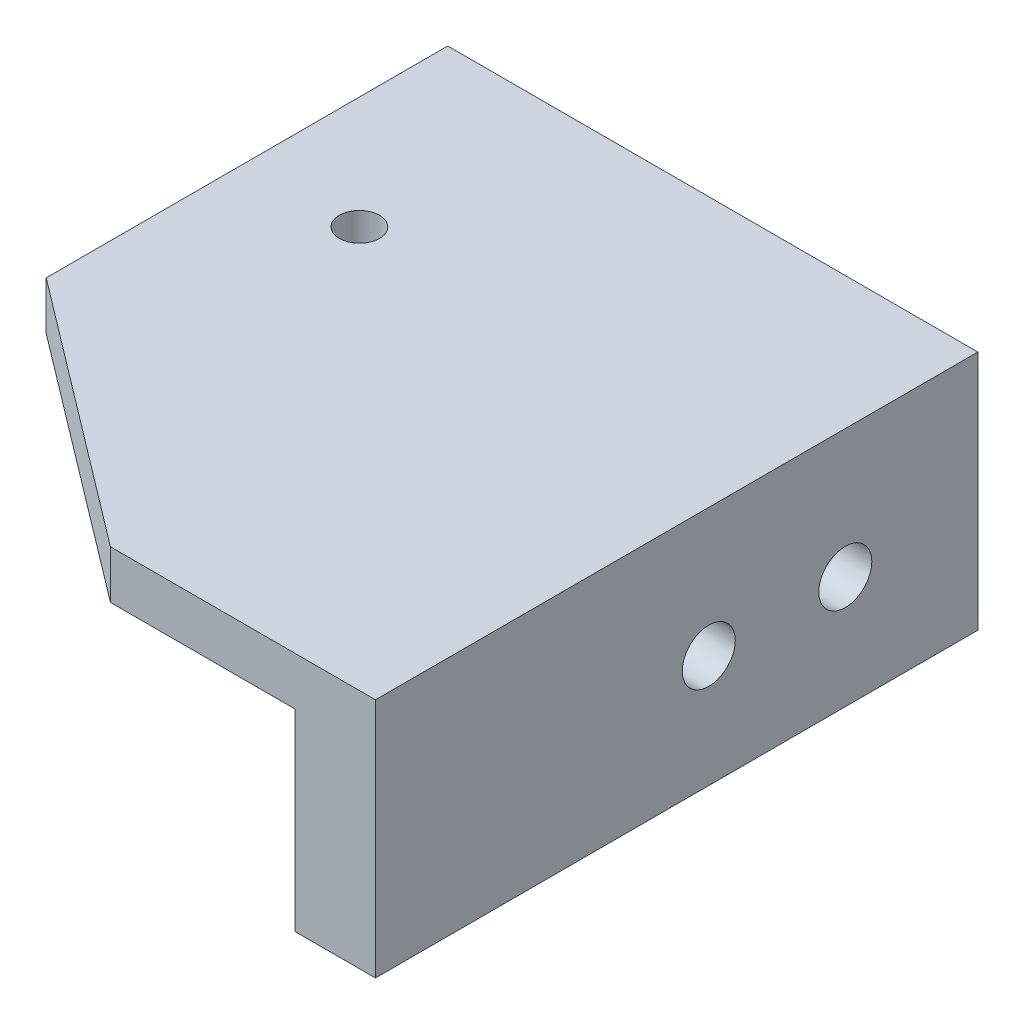
ISO-10303-21;
HEADER;
FILE_DESCRIPTION(('STEP AP214'),'2;1');
FILE_NAME('part.step','',(''),(''),'','','');
FILE_SCHEMA(('AUTOMOTIVE_DESIGN { 1 0 10303 214 1 1 1 1 }'));
ENDSEC;
DATA;
#1=APPLICATION_CONTEXT('core data for automotive mechanical design processes');
#2=APPLICATION_PROTOCOL_DEFINITION('international standard','automotive_design',2000,#1);
#3=PRODUCT_CONTEXT('',#1,'mechanical');
#4=PRODUCT('Part','Part','',(#3));
#5=PRODUCT_RELATED_PRODUCT_CATEGORY('part','',(#4));
#6=PRODUCT_DEFINITION_FORMATION('','',#4);
#7=PRODUCT_DEFINITION_CONTEXT('part definition',#1,'design');
#8=PRODUCT_DEFINITION('design','',#6,#7);
#9=PRODUCT_DEFINITION_SHAPE('','',#8);
#10=(LENGTH_UNIT() NAMED_UNIT(*) SI_UNIT(.MILLI.,.METRE.));
#11=(NAMED_UNIT(*) PLANE_ANGLE_UNIT() SI_UNIT($,.RADIAN.));
#12=(NAMED_UNIT(*) SI_UNIT($,.STERADIAN.) SOLID_ANGLE_UNIT());
#13=UNCERTAINTY_MEASURE_WITH_UNIT(LENGTH_MEASURE(1.E-05),#10,'distance_accuracy_value','');
#14=(GEOMETRIC_REPRESENTATION_CONTEXT(3) GLOBAL_UNCERTAINTY_ASSIGNED_CONTEXT((#13)) GLOBAL_UNIT_ASSIGNED_CONTEXT((#10,
#11,#12)) REPRESENTATION_CONTEXT('',''));
#15=CARTESIAN_POINT('',(0.,0.,0.));
#16=DIRECTION('',(0.,0.,1.));
#17=DIRECTION('',(1.,0.,0.));
#18=AXIS2_PLACEMENT_3D('',#15,#16,#17);
#19=CARTESIAN_POINT('',(-16.5,7.5,-12.5));
#20=DIRECTION('',(-1.,0.,0.));
#21=DIRECTION('',(0.,0.,1.));
#22=AXIS2_PLACEMENT_3D('',#19,#20,#21);
#23=PLANE('',#22);
#24=DIRECTION('',(0.,1.,0.));
#25=VECTOR('',#24,1.);
#26=CARTESIAN_POINT('',(-16.5,-7.5,12.5));
#27=LINE('',#26,#25);
#28=CARTESIAN_POINT('',(-16.5,4.5,12.5));
#29=VERTEX_POINT('',#28);
#30=CARTESIAN_POINT('',(-16.5,7.5,12.5));
#31=VERTEX_POINT('',#30);
#32=EDGE_CURVE('E48',#29,#31,#27,.T.);
#33=ORIENTED_EDGE('',*,*,#32,.T.);
#34=DIRECTION('',(0.,0.,1.));
#35=VECTOR('',#34,1.);
#36=CARTESIAN_POINT('',(-16.5,7.5,-12.5));
#37=LINE('',#36,#35);
#38=CARTESIAN_POINT('',(-16.5,7.5,-12.5));
#39=VERTEX_POINT('',#38);
#40=EDGE_CURVE('E41',#39,#31,#37,.T.);
#41=ORIENTED_EDGE('',*,*,#40,.F.);
#42=DIRECTION('',(0.,-1.,0.));
#43=VECTOR('',#42,1.);
#44=CARTESIAN_POINT('',(-16.5,7.5,-12.5));
#45=LINE('',#44,#43);
#46=CARTESIAN_POINT('',(-16.5,4.5,-12.5));
#47=VERTEX_POINT('',#46);
#48=EDGE_CURVE('E111',#39,#47,#45,.T.);
#49=ORIENTED_EDGE('',*,*,#48,.T.);
#50=DIRECTION('',(0.,0.,1.));
#51=VECTOR('',#50,1.);
#52=CARTESIAN_POINT('',(-16.5,4.5,-12.5));
#53=LINE('',#52,#51);
#54=EDGE_CURVE('E148',#47,#29,#53,.T.);
#55=ORIENTED_EDGE('',*,*,#54,.T.);
#56=EDGE_LOOP('',(#33,#41,#49,#55));
#57=FACE_BOUND('',#56,.T.);
#58=ADVANCED_FACE('F34',(#57),#23,.T.);
#59=CARTESIAN_POINT('',(-16.5,7.5,-12.5));
#60=DIRECTION('',(0.,1.,0.));
#61=DIRECTION('',(0.,0.,1.));
#62=AXIS2_PLACEMENT_3D('',#59,#60,#61);
#63=PLANE('',#62);
#64=DIRECTION('',(-0.79709214815401,0.,-0.603857687995462));
#65=VECTOR('',#64,1.);
#66=CARTESIAN_POINT('',(0.,7.5,25.));
#67=LINE('',#66,#65);
#68=CARTESIAN_POINT('',(0.,7.5,25.));
#69=VERTEX_POINT('',#68);
#70=EDGE_CURVE('E93',#69,#31,#67,.T.);
#71=ORIENTED_EDGE('',*,*,#70,.F.);
#72=DIRECTION('',(-1.,0.,0.));
#73=VECTOR('',#72,1.);
#74=CARTESIAN_POINT('',(-16.5,7.5,25.));
#75=LINE('',#74,#73);
#76=CARTESIAN_POINT('',(16.5,7.5,25.));
#77=VERTEX_POINT('',#76);
#78=EDGE_CURVE('E104',#77,#69,#75,.T.);
#79=ORIENTED_EDGE('',*,*,#78,.F.);
#80=DIRECTION('',(0.,0.,1.));
#81=VECTOR('',#80,1.);
#82=CARTESIAN_POINT('',(16.5,7.5,-12.5));
#83=LINE('',#82,#81);
#84=CARTESIAN_POINT('',(16.5,7.5,-12.5));
#85=VERTEX_POINT('',#84);
#86=EDGE_CURVE('E128',#85,#77,#83,.T.);
#87=ORIENTED_EDGE('',*,*,#86,.F.);
#88=DIRECTION('',(-1.,0.,0.));
#89=VECTOR('',#88,1.);
#90=CARTESIAN_POINT('',(-16.5,7.5,-12.5));
#91=LINE('',#90,#89);
#92=EDGE_CURVE('E124',#85,#39,#91,.T.);
#93=ORIENTED_EDGE('',*,*,#92,.T.);
#94=ORIENTED_EDGE('',*,*,#40,.T.);
#95=EDGE_LOOP('',(#71,#79,#87,#93,#94));
#96=FACE_BOUND('',#95,.T.);
#97=CARTESIAN_POINT('',(-9.5,7.5,0.));
#98=DIRECTION('',(0.,1.,0.));
#99=DIRECTION('',(0.,0.,1.));
#100=AXIS2_PLACEMENT_3D('',#97,#98,#99);
#101=CIRCLE('',#100,1.24999999999999);
#102=CARTESIAN_POINT('',(-9.5,7.5,1.24999999999999));
#103=VERTEX_POINT('',#102);
#104=EDGE_CURVE('E163',#103,#103,#101,.T.);
#105=ORIENTED_EDGE('',*,*,#104,.F.);
#106=EDGE_LOOP('',(#105));
#107=FACE_BOUND('',#106,.T.);
#108=ADVANCED_FACE('F102',(#96,#107),#63,.T.);
#109=CARTESIAN_POINT('',(16.5,7.5,-12.5));
#110=DIRECTION('',(1.,0.,0.));
#111=DIRECTION('',(0.,0.,-1.));
#112=AXIS2_PLACEMENT_3D('',#109,#110,#111);
#113=PLANE('',#112);
#114=CARTESIAN_POINT('',(16.5,-0.5,4.25));
#115=DIRECTION('',(1.,0.,0.));
#116=DIRECTION('',(0.,0.,-1.));
#117=AXIS2_PLACEMENT_3D('',#114,#115,#116);
#118=CIRCLE('',#117,1.64999999999999);
#119=CARTESIAN_POINT('',(16.5,-0.5,2.60000000000001));
#120=VERTEX_POINT('',#119);
#121=EDGE_CURVE('E149',#120,#120,#118,.T.);
#122=ORIENTED_EDGE('',*,*,#121,.F.);
#123=EDGE_LOOP('',(#122));
#124=FACE_BOUND('',#123,.T.);
#125=CARTESIAN_POINT('',(16.5,-0.499999999999999,-4.25));
#126=DIRECTION('',(1.,0.,0.));
#127=DIRECTION('',(0.,0.,-1.));
#128=AXIS2_PLACEMENT_3D('',#125,#126,#127);
#129=CIRCLE('',#128,1.64999999999999);
#130=CARTESIAN_POINT('',(16.5,-0.499999999999999,-5.89999999999999));
#131=VERTEX_POINT('',#130);
#132=EDGE_CURVE('E157',#131,#131,#129,.T.);
#133=ORIENTED_EDGE('',*,*,#132,.F.);
#134=EDGE_LOOP('',(#133));
#135=FACE_BOUND('',#134,.T.);
#136=ORIENTED_EDGE('',*,*,#86,.T.);
#137=DIRECTION('',(0.,1.,0.));
#138=VECTOR('',#137,1.);
#139=CARTESIAN_POINT('',(16.5,7.5,25.));
#140=LINE('',#139,#138);
#141=CARTESIAN_POINT('',(16.5,-7.5,25.));
#142=VERTEX_POINT('',#141);
#143=EDGE_CURVE('E110',#142,#77,#140,.T.);
#144=ORIENTED_EDGE('',*,*,#143,.F.);
#145=DIRECTION('',(0.,0.,1.));
#146=VECTOR('',#145,1.);
#147=CARTESIAN_POINT('',(16.5,-7.5,-12.5));
#148=LINE('',#147,#146);
#149=CARTESIAN_POINT('',(16.5,-7.5,-12.5));
#150=VERTEX_POINT('',#149);
#151=EDGE_CURVE('E126',#150,#142,#148,.T.);
#152=ORIENTED_EDGE('',*,*,#151,.F.);
#153=DIRECTION('',(0.,1.,0.));
#154=VECTOR('',#153,1.);
#155=CARTESIAN_POINT('',(16.5,7.5,-12.5));
#156=LINE('',#155,#154);
#157=EDGE_CURVE('E121',#150,#85,#156,.T.);
#158=ORIENTED_EDGE('',*,*,#157,.T.);
#159=EDGE_LOOP('',(#136,#144,#152,#158));
#160=FACE_BOUND('',#159,.T.);
#161=ADVANCED_FACE('F137',(#124,#135,#160),#113,.T.);
#162=CARTESIAN_POINT('',(-16.5,-7.5,-12.5));
#163=DIRECTION('',(0.,-1.,0.));
#164=DIRECTION('',(0.,0.,-1.));
#165=AXIS2_PLACEMENT_3D('',#162,#163,#164);
#166=PLANE('',#165);
#167=DIRECTION('',(0.,0.,1.));
#168=VECTOR('',#167,1.);
#169=CARTESIAN_POINT('',(11.5,-7.5,-12.5));
#170=LINE('',#169,#168);
#171=CARTESIAN_POINT('',(11.5,-7.5,-12.5));
#172=VERTEX_POINT('',#171);
#173=CARTESIAN_POINT('',(11.5,-7.5,25.));
#174=VERTEX_POINT('',#173);
#175=EDGE_CURVE('E55',#172,#174,#170,.T.);
#176=ORIENTED_EDGE('',*,*,#175,.F.);
#177=DIRECTION('',(1.,0.,0.));
#178=VECTOR('',#177,1.);
#179=CARTESIAN_POINT('',(-16.5,-7.5,-12.5));
#180=LINE('',#179,#178);
#181=EDGE_CURVE('E114',#172,#150,#180,.T.);
#182=ORIENTED_EDGE('',*,*,#181,.T.);
#183=ORIENTED_EDGE('',*,*,#151,.T.);
#184=DIRECTION('',(1.,0.,0.));
#185=VECTOR('',#184,1.);
#186=CARTESIAN_POINT('',(-16.5,-7.5,25.));
#187=LINE('',#186,#185);
#188=EDGE_CURVE('E116',#174,#142,#187,.T.);
#189=ORIENTED_EDGE('',*,*,#188,.F.);
#190=EDGE_LOOP('',(#176,#182,#183,#189));
#191=FACE_BOUND('',#190,.T.);
#192=ADVANCED_FACE('F133',(#191),#166,.T.);
#193=CARTESIAN_POINT('',(0.,0.,-12.5));
#194=DIRECTION('',(0.,0.,1.));
#195=DIRECTION('',(1.,0.,0.));
#196=AXIS2_PLACEMENT_3D('',#193,#194,#195);
#197=PLANE('',#196);
#198=DIRECTION('',(0.,1.,0.));
#199=VECTOR('',#198,1.);
#200=CARTESIAN_POINT('',(11.5,-7.5,-12.5));
#201=LINE('',#200,#199);
#202=CARTESIAN_POINT('',(11.5,4.5,-12.5));
#203=VERTEX_POINT('',#202);
#204=EDGE_CURVE('E170',#172,#203,#201,.T.);
#205=ORIENTED_EDGE('',*,*,#204,.T.);
#206=DIRECTION('',(-1.,0.,0.));
#207=VECTOR('',#206,1.);
#208=CARTESIAN_POINT('',(-16.5,4.5,-12.5));
#209=LINE('',#208,#207);
#210=EDGE_CURVE('E145',#203,#47,#209,.T.);
#211=ORIENTED_EDGE('',*,*,#210,.T.);
#212=ORIENTED_EDGE('',*,*,#48,.F.);
#213=ORIENTED_EDGE('',*,*,#92,.F.);
#214=ORIENTED_EDGE('',*,*,#157,.F.);
#215=ORIENTED_EDGE('',*,*,#181,.F.);
#216=EDGE_LOOP('',(#205,#211,#212,#213,#214,#215));
#217=FACE_BOUND('',#216,.T.);
#218=ADVANCED_FACE('F142',(#217),#197,.F.);
#219=CARTESIAN_POINT('',(0.,0.,25.));
#220=DIRECTION('',(0.,0.,1.));
#221=DIRECTION('',(1.,0.,0.));
#222=AXIS2_PLACEMENT_3D('',#219,#220,#221);
#223=PLANE('',#222);
#224=DIRECTION('',(0.,1.,0.));
#225=VECTOR('',#224,1.);
#226=CARTESIAN_POINT('',(0.,-7.5,25.));
#227=LINE('',#226,#225);
#228=CARTESIAN_POINT('',(0.,4.5,25.));
#229=VERTEX_POINT('',#228);
#230=EDGE_CURVE('E90',#229,#69,#227,.T.);
#231=ORIENTED_EDGE('',*,*,#230,.F.);
#232=DIRECTION('',(-1.,0.,0.));
#233=VECTOR('',#232,1.);
#234=CARTESIAN_POINT('',(-16.5,4.5,25.));
#235=LINE('',#234,#233);
#236=CARTESIAN_POINT('',(11.5,4.5,25.));
#237=VERTEX_POINT('',#236);
#238=EDGE_CURVE('E172',#237,#229,#235,.T.);
#239=ORIENTED_EDGE('',*,*,#238,.F.);
#240=DIRECTION('',(0.,1.,0.));
#241=VECTOR('',#240,1.);
#242=CARTESIAN_POINT('',(11.5,-7.5,25.));
#243=LINE('',#242,#241);
#244=EDGE_CURVE('E169',#174,#237,#243,.T.);
#245=ORIENTED_EDGE('',*,*,#244,.F.);
#246=ORIENTED_EDGE('',*,*,#188,.T.);
#247=ORIENTED_EDGE('',*,*,#143,.T.);
#248=ORIENTED_EDGE('',*,*,#78,.T.);
#249=EDGE_LOOP('',(#231,#239,#245,#246,#247,#248));
#250=FACE_BOUND('',#249,.T.);
#251=ADVANCED_FACE('F108',(#250),#223,.T.);
#252=CARTESIAN_POINT('',(-16.5,4.5,-12.5));
#253=DIRECTION('',(0.,1.,0.));
#254=DIRECTION('',(0.,0.,1.));
#255=AXIS2_PLACEMENT_3D('',#252,#253,#254);
#256=PLANE('',#255);
#257=CARTESIAN_POINT('',(-9.5,4.5,0.));
#258=DIRECTION('',(0.,1.,0.));
#259=DIRECTION('',(0.,0.,1.));
#260=AXIS2_PLACEMENT_3D('',#257,#258,#259);
#261=CIRCLE('',#260,1.24999999999999);
#262=CARTESIAN_POINT('',(-9.5,4.5,1.24999999999999));
#263=VERTEX_POINT('',#262);
#264=EDGE_CURVE('E166',#263,#263,#261,.T.);
#265=ORIENTED_EDGE('',*,*,#264,.T.);
#266=EDGE_LOOP('',(#265));
#267=FACE_BOUND('',#266,.T.);
#268=ORIENTED_EDGE('',*,*,#238,.T.);
#269=DIRECTION('',(-0.797092148154011,0.,-0.603857687995462));
#270=VECTOR('',#269,1.);
#271=CARTESIAN_POINT('',(-28.5332555425904,4.5,3.38389731621937));
#272=LINE('',#271,#270);
#273=EDGE_CURVE('E11',#229,#29,#272,.T.);
#274=ORIENTED_EDGE('',*,*,#273,.T.);
#275=ORIENTED_EDGE('',*,*,#54,.F.);
#276=ORIENTED_EDGE('',*,*,#210,.F.);
#277=DIRECTION('',(0.,0.,1.));
#278=VECTOR('',#277,1.);
#279=CARTESIAN_POINT('',(11.5,4.5,-12.5));
#280=LINE('',#279,#278);
#281=EDGE_CURVE('E177',#203,#237,#280,.T.);
#282=ORIENTED_EDGE('',*,*,#281,.T.);
#283=EDGE_LOOP('',(#268,#274,#275,#276,#282));
#284=FACE_BOUND('',#283,.T.);
#285=ADVANCED_FACE('F181',(#267,#284),#256,.F.);
#286=CARTESIAN_POINT('',(11.5,-7.5,-12.5));
#287=DIRECTION('',(1.,0.,0.));
#288=DIRECTION('',(0.,0.,-1.));
#289=AXIS2_PLACEMENT_3D('',#286,#287,#288);
#290=PLANE('',#289);
#291=CARTESIAN_POINT('',(11.5,-0.5,4.25));
#292=DIRECTION('',(1.,0.,0.));
#293=DIRECTION('',(0.,0.,-1.));
#294=AXIS2_PLACEMENT_3D('',#291,#292,#293);
#295=CIRCLE('',#294,1.65);
#296=CARTESIAN_POINT('',(11.5,-0.5,2.6));
#297=VERTEX_POINT('',#296);
#298=EDGE_CURVE('E152',#297,#297,#295,.T.);
#299=ORIENTED_EDGE('',*,*,#298,.T.);
#300=EDGE_LOOP('',(#299));
#301=FACE_BOUND('',#300,.T.);
#302=CARTESIAN_POINT('',(11.5,-0.499999999999999,-4.25));
#303=DIRECTION('',(1.,0.,0.));
#304=DIRECTION('',(0.,0.,-1.));
#305=AXIS2_PLACEMENT_3D('',#302,#303,#304);
#306=CIRCLE('',#305,1.65);
#307=CARTESIAN_POINT('',(11.5,-0.499999999999999,-5.9));
#308=VERTEX_POINT('',#307);
#309=EDGE_CURVE('E160',#308,#308,#306,.T.);
#310=ORIENTED_EDGE('',*,*,#309,.T.);
#311=EDGE_LOOP('',(#310));
#312=FACE_BOUND('',#311,.T.);
#313=ORIENTED_EDGE('',*,*,#244,.T.);
#314=ORIENTED_EDGE('',*,*,#281,.F.);
#315=ORIENTED_EDGE('',*,*,#204,.F.);
#316=ORIENTED_EDGE('',*,*,#175,.T.);
#317=EDGE_LOOP('',(#313,#314,#315,#316));
#318=FACE_BOUND('',#317,.T.);
#319=ADVANCED_FACE('F179',(#301,#312,#318),#290,.F.);
#320=CARTESIAN_POINT('',(-9.5,7.5,0.));
#321=DIRECTION('',(0.,1.,0.));
#322=DIRECTION('',(0.,0.,1.));
#323=AXIS2_PLACEMENT_3D('',#320,#321,#322);
#324=CYLINDRICAL_SURFACE('',#323,1.24999999999999);
#325=ORIENTED_EDGE('',*,*,#264,.F.);
#326=EDGE_LOOP('',(#325));
#327=FACE_BOUND('',#326,.T.);
#328=ORIENTED_EDGE('',*,*,#104,.T.);
#329=EDGE_LOOP('',(#328));
#330=FACE_BOUND('',#329,.T.);
#331=ADVANCED_FACE('F189',(#327,#330),#324,.F.);
#332=CARTESIAN_POINT('',(16.5,-0.499999999999999,-4.25));
#333=DIRECTION('',(1.,0.,0.));
#334=DIRECTION('',(0.,0.,-1.));
#335=AXIS2_PLACEMENT_3D('',#332,#333,#334);
#336=CYLINDRICAL_SURFACE('',#335,1.65);
#337=ORIENTED_EDGE('',*,*,#309,.F.);
#338=EDGE_LOOP('',(#337));
#339=FACE_BOUND('',#338,.T.);
#340=ORIENTED_EDGE('',*,*,#132,.T.);
#341=EDGE_LOOP('',(#340));
#342=FACE_BOUND('',#341,.T.);
#343=ADVANCED_FACE('F241',(#339,#342),#336,.F.);
#344=CARTESIAN_POINT('',(16.5,-0.5,4.25));
#345=DIRECTION('',(1.,0.,0.));
#346=DIRECTION('',(0.,0.,-1.));
#347=AXIS2_PLACEMENT_3D('',#344,#345,#346);
#348=CYLINDRICAL_SURFACE('',#347,1.65);
#349=ORIENTED_EDGE('',*,*,#298,.F.);
#350=EDGE_LOOP('',(#349));
#351=FACE_BOUND('',#350,.T.);
#352=ORIENTED_EDGE('',*,*,#121,.T.);
#353=EDGE_LOOP('',(#352));
#354=FACE_BOUND('',#353,.T.);
#355=ADVANCED_FACE('F231',(#351,#354),#348,.F.);
#356=CARTESIAN_POINT('',(0.,-7.5,25.));
#357=DIRECTION('',(0.603857687995462,0.,-0.79709214815401));
#358=DIRECTION('',(-0.797092148154011,0.,-0.603857687995462));
#359=AXIS2_PLACEMENT_3D('',#356,#357,#358);
#360=PLANE('',#359);
#361=ORIENTED_EDGE('',*,*,#230,.T.);
#362=ORIENTED_EDGE('',*,*,#70,.T.);
#363=ORIENTED_EDGE('',*,*,#32,.F.);
#364=ORIENTED_EDGE('',*,*,#273,.F.);
#365=EDGE_LOOP('',(#361,#362,#363,#364));
#366=FACE_BOUND('',#365,.T.);
#367=ADVANCED_FACE('F92',(#366),#360,.F.);
#368=CLOSED_SHELL('',(#58,#108,#161,#192,#218,#251,#285,#319,#331,#343,#355,#367));
#369=MANIFOLD_SOLID_BREP('B2',#368);
#370=ADVANCED_BREP_SHAPE_REPRESENTATION('',(#18,#369),#14);
#371=SHAPE_DEFINITION_REPRESENTATION(#9,#370);
ENDSEC;
END-ISO-10303-21;
